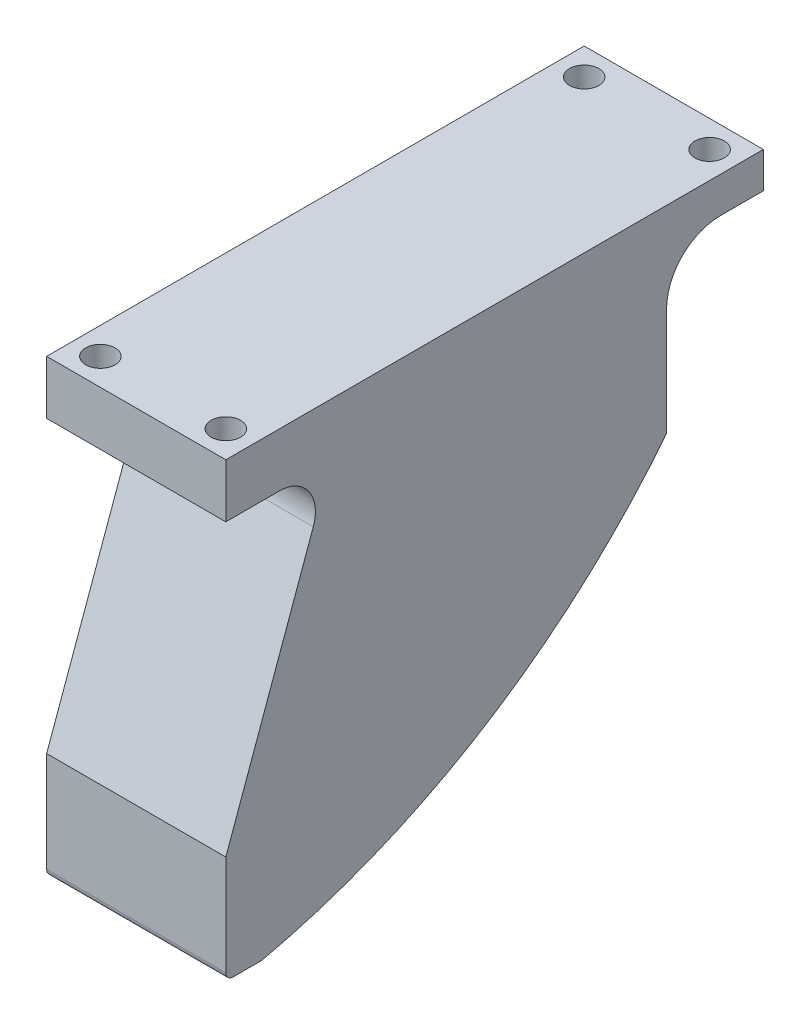
ISO-10303-21;
HEADER;
FILE_DESCRIPTION(('STEP AP214'),'2;1');
FILE_NAME('part.step','',(''),(''),'','','');
FILE_SCHEMA(('AUTOMOTIVE_DESIGN { 1 0 10303 214 1 1 1 1 }'));
ENDSEC;
DATA;
#1=APPLICATION_CONTEXT('core data for automotive mechanical design processes');
#2=APPLICATION_PROTOCOL_DEFINITION('international standard','automotive_design',2000,#1);
#3=PRODUCT_CONTEXT('',#1,'mechanical');
#4=PRODUCT('Part','Part','',(#3));
#5=PRODUCT_RELATED_PRODUCT_CATEGORY('part','',(#4));
#6=PRODUCT_DEFINITION_FORMATION('','',#4);
#7=PRODUCT_DEFINITION_CONTEXT('part definition',#1,'design');
#8=PRODUCT_DEFINITION('design','',#6,#7);
#9=PRODUCT_DEFINITION_SHAPE('','',#8);
#10=(LENGTH_UNIT() NAMED_UNIT(*) SI_UNIT(.MILLI.,.METRE.));
#11=(NAMED_UNIT(*) PLANE_ANGLE_UNIT() SI_UNIT($,.RADIAN.));
#12=(NAMED_UNIT(*) SI_UNIT($,.STERADIAN.) SOLID_ANGLE_UNIT());
#13=UNCERTAINTY_MEASURE_WITH_UNIT(LENGTH_MEASURE(1.E-05),#10,'distance_accuracy_value','');
#14=(GEOMETRIC_REPRESENTATION_CONTEXT(3) GLOBAL_UNCERTAINTY_ASSIGNED_CONTEXT((#13)) GLOBAL_UNIT_ASSIGNED_CONTEXT((#10,
#11,#12)) REPRESENTATION_CONTEXT('',''));
#15=CARTESIAN_POINT('',(0.,0.,0.));
#16=DIRECTION('',(0.,0.,1.));
#17=DIRECTION('',(1.,0.,0.));
#18=AXIS2_PLACEMENT_3D('',#15,#16,#17);
#19=CARTESIAN_POINT('',(0.,-46.750329049547,-58.1304748212491));
#20=DIRECTION('',(1.,0.,0.));
#21=DIRECTION('',(0.,1.,0.));
#22=AXIS2_PLACEMENT_3D('',#19,#20,#21);
#23=PLANE('',#22);
#24=CARTESIAN_POINT('',(0.,-124.,-2.));
#25=DIRECTION('',(1.,0.,0.));
#26=DIRECTION('',(0.,-0.707106781186546,0.707106781186549));
#27=AXIS2_PLACEMENT_3D('',#24,#25,#26);
#28=CIRCLE('',#27,2.);
#29=CARTESIAN_POINT('',(0.,-124.,0.));
#30=VERTEX_POINT('',#29);
#31=CARTESIAN_POINT('',(0.,-126.,-2.));
#32=VERTEX_POINT('',#31);
#33=EDGE_CURVE('E217',#30,#32,#28,.T.);
#34=ORIENTED_EDGE('',*,*,#33,.F.);
#35=DIRECTION('',(0.,1.,0.));
#36=VECTOR('',#35,1.);
#37=CARTESIAN_POINT('',(0.,-126.,0.));
#38=LINE('',#37,#36);
#39=CARTESIAN_POINT('',(0.,-96.,0.));
#40=VERTEX_POINT('',#39);
#41=EDGE_CURVE('E212',#30,#40,#38,.T.);
#42=ORIENTED_EDGE('',*,*,#41,.T.);
#43=DIRECTION('',(0.,0.94058436813575,-0.339560077775158));
#44=VECTOR('',#43,1.);
#45=CARTESIAN_POINT('',(0.,-31.1292362331338,-23.4189747738099));
#46=LINE('',#45,#44);
#47=CARTESIAN_POINT('',(0.,-28.3956007777516,-24.4058436813575));
#48=VERTEX_POINT('',#47);
#49=EDGE_CURVE('E333',#40,#48,#46,.T.);
#50=ORIENTED_EDGE('',*,*,#49,.T.);
#51=CARTESIAN_POINT('',(0.,-25.,-15.));
#52=DIRECTION('',(1.,0.,0.));
#53=DIRECTION('',(0.,-0.339560077775158,-0.94058436813575));
#54=AXIS2_PLACEMENT_3D('',#51,#52,#53);
#55=CIRCLE('',#54,10.);
#56=CARTESIAN_POINT('',(0.,-15.,-15.));
#57=VERTEX_POINT('',#56);
#58=EDGE_CURVE('E307',#48,#57,#55,.T.);
#59=ORIENTED_EDGE('',*,*,#58,.T.);
#60=DIRECTION('',(0.,0.,1.));
#61=VECTOR('',#60,1.);
#62=CARTESIAN_POINT('',(0.,-15.,-29.0652374106246));
#63=LINE('',#62,#61);
#64=CARTESIAN_POINT('',(0.,-15.,0.));
#65=VERTEX_POINT('',#64);
#66=EDGE_CURVE('E320',#57,#65,#63,.T.);
#67=ORIENTED_EDGE('',*,*,#66,.T.);
#68=DIRECTION('',(0.,1.,0.));
#69=VECTOR('',#68,1.);
#70=CARTESIAN_POINT('',(0.,-126.,0.));
#71=LINE('',#70,#69);
#72=CARTESIAN_POINT('',(0.,0.,0.));
#73=VERTEX_POINT('',#72);
#74=EDGE_CURVE('E233',#65,#73,#71,.T.);
#75=ORIENTED_EDGE('',*,*,#74,.T.);
#76=DIRECTION('',(0.,0.,-1.));
#77=VECTOR('',#76,1.);
#78=CARTESIAN_POINT('',(0.,0.,0.));
#79=LINE('',#78,#77);
#80=CARTESIAN_POINT('',(0.,0.,-150.));
#81=VERTEX_POINT('',#80);
#82=EDGE_CURVE('E11',#73,#81,#79,.T.);
#83=ORIENTED_EDGE('',*,*,#82,.T.);
#84=DIRECTION('',(0.,-1.,0.));
#85=VECTOR('',#84,1.);
#86=CARTESIAN_POINT('',(0.,0.,-150.));
#87=LINE('',#86,#85);
#88=CARTESIAN_POINT('',(0.,-10.,-150.));
#89=VERTEX_POINT('',#88);
#90=EDGE_CURVE('E237',#81,#89,#87,.T.);
#91=ORIENTED_EDGE('',*,*,#90,.T.);
#92=DIRECTION('',(0.,0.,1.));
#93=VECTOR('',#92,1.);
#94=CARTESIAN_POINT('',(0.,-10.,-98.0652374106246));
#95=LINE('',#94,#93);
#96=CARTESIAN_POINT('',(0.,-10.,-138.));
#97=VERTEX_POINT('',#96);
#98=EDGE_CURVE('E338',#89,#97,#95,.T.);
#99=ORIENTED_EDGE('',*,*,#98,.T.);
#100=CARTESIAN_POINT('',(0.,-25.,-138.));
#101=DIRECTION('',(1.,0.,0.));
#102=DIRECTION('',(0.,1.,0.));
#103=AXIS2_PLACEMENT_3D('',#100,#101,#102);
#104=CIRCLE('',#103,15.);
#105=CARTESIAN_POINT('',(0.,-25.,-123.));
#106=VERTEX_POINT('',#105);
#107=EDGE_CURVE('E344',#97,#106,#104,.T.);
#108=ORIENTED_EDGE('',*,*,#107,.T.);
#109=DIRECTION('',(0.,-1.,0.));
#110=VECTOR('',#109,1.);
#111=CARTESIAN_POINT('',(0.,-50.9512075724548,-123.));
#112=LINE('',#111,#110);
#113=CARTESIAN_POINT('',(0.,-55.1520860953626,-123.));
#114=VERTEX_POINT('',#113);
#115=EDGE_CURVE('E266',#106,#114,#112,.T.);
#116=ORIENTED_EDGE('',*,*,#115,.T.);
#117=CARTESIAN_POINT('',(0.,69.1762667897678,33.6603353400933));
#118=DIRECTION('',(-1.,0.,0.));
#119=DIRECTION('',(0.,0.975881333948839,0.218301676700467));
#120=AXIS2_PLACEMENT_3D('',#117,#118,#119);
#121=CIRCLE('',#120,200.);
#122=CARTESIAN_POINT('',(0.,-126.,-10.));
#123=VERTEX_POINT('',#122);
#124=EDGE_CURVE('E232',#114,#123,#121,.T.);
#125=ORIENTED_EDGE('',*,*,#124,.T.);
#126=DIRECTION('',(0.,0.,1.));
#127=VECTOR('',#126,1.);
#128=CARTESIAN_POINT('',(0.,-126.,-10.));
#129=LINE('',#128,#127);
#130=EDGE_CURVE('E28',#123,#32,#129,.T.);
#131=ORIENTED_EDGE('',*,*,#130,.T.);
#132=EDGE_LOOP('',(#34,#42,#50,#59,#67,#75,#83,#91,#99,#108,#116,#125,#131));
#133=FACE_BOUND('',#132,.T.);
#134=ADVANCED_FACE('F17',(#133),#23,.F.);
#135=CARTESIAN_POINT('',(0.,0.,-150.));
#136=DIRECTION('',(0.,1.,0.));
#137=DIRECTION('',(0.,0.,-1.));
#138=AXIS2_PLACEMENT_3D('',#135,#136,#137);
#139=PLANE('',#138);
#140=CARTESIAN_POINT('',(42.5,0.,-7.5));
#141=DIRECTION('',(0.,-1.,0.));
#142=DIRECTION('',(1.,0.,0.));
#143=AXIS2_PLACEMENT_3D('',#140,#141,#142);
#144=CIRCLE('',#143,4.1);
#145=CARTESIAN_POINT('',(38.4,0.,-7.5));
#146=VERTEX_POINT('',#145);
#147=EDGE_CURVE('E239',#146,#146,#144,.T.);
#148=ORIENTED_EDGE('',*,*,#147,.T.);
#149=EDGE_LOOP('',(#148));
#150=FACE_BOUND('',#149,.T.);
#151=CARTESIAN_POINT('',(7.5,0.,-142.5));
#152=DIRECTION('',(0.,-1.,0.));
#153=DIRECTION('',(1.,0.,0.));
#154=AXIS2_PLACEMENT_3D('',#151,#152,#153);
#155=CIRCLE('',#154,4.1);
#156=CARTESIAN_POINT('',(3.4,0.,-142.5));
#157=VERTEX_POINT('',#156);
#158=EDGE_CURVE('E278',#157,#157,#155,.T.);
#159=ORIENTED_EDGE('',*,*,#158,.T.);
#160=EDGE_LOOP('',(#159));
#161=FACE_BOUND('',#160,.T.);
#162=CARTESIAN_POINT('',(7.5,0.,-7.5));
#163=DIRECTION('',(0.,-1.,0.));
#164=DIRECTION('',(1.,0.,0.));
#165=AXIS2_PLACEMENT_3D('',#162,#163,#164);
#166=CIRCLE('',#165,4.1);
#167=CARTESIAN_POINT('',(3.4,0.,-7.5));
#168=VERTEX_POINT('',#167);
#169=EDGE_CURVE('E267',#168,#168,#166,.T.);
#170=ORIENTED_EDGE('',*,*,#169,.T.);
#171=EDGE_LOOP('',(#170));
#172=FACE_BOUND('',#171,.T.);
#173=CARTESIAN_POINT('',(42.5,0.,-142.5));
#174=DIRECTION('',(0.,-1.,0.));
#175=DIRECTION('',(1.,0.,0.));
#176=AXIS2_PLACEMENT_3D('',#173,#174,#175);
#177=CIRCLE('',#176,4.1);
#178=CARTESIAN_POINT('',(38.4,0.,-142.5));
#179=VERTEX_POINT('',#178);
#180=EDGE_CURVE('E245',#179,#179,#177,.T.);
#181=ORIENTED_EDGE('',*,*,#180,.T.);
#182=EDGE_LOOP('',(#181));
#183=FACE_BOUND('',#182,.T.);
#184=ORIENTED_EDGE('',*,*,#82,.F.);
#185=DIRECTION('',(1.,0.,0.));
#186=VECTOR('',#185,1.);
#187=CARTESIAN_POINT('',(0.,0.,0.));
#188=LINE('',#187,#186);
#189=CARTESIAN_POINT('',(50.,0.,0.));
#190=VERTEX_POINT('',#189);
#191=EDGE_CURVE('E238',#73,#190,#188,.T.);
#192=ORIENTED_EDGE('',*,*,#191,.T.);
#193=DIRECTION('',(0.,0.,1.));
#194=VECTOR('',#193,1.);
#195=CARTESIAN_POINT('',(50.,0.,0.));
#196=LINE('',#195,#194);
#197=CARTESIAN_POINT('',(50.,0.,-150.));
#198=VERTEX_POINT('',#197);
#199=EDGE_CURVE('E270',#198,#190,#196,.T.);
#200=ORIENTED_EDGE('',*,*,#199,.F.);
#201=DIRECTION('',(1.,0.,0.));
#202=VECTOR('',#201,1.);
#203=CARTESIAN_POINT('',(0.,0.,-150.));
#204=LINE('',#203,#202);
#205=EDGE_CURVE('E139',#81,#198,#204,.T.);
#206=ORIENTED_EDGE('',*,*,#205,.F.);
#207=EDGE_LOOP('',(#184,#192,#200,#206));
#208=FACE_BOUND('',#207,.T.);
#209=ADVANCED_FACE('F384',(#150,#161,#172,#183,#208),#139,.T.);
#210=CARTESIAN_POINT('',(0.,-126.,0.));
#211=DIRECTION('',(0.,-1.,0.));
#212=DIRECTION('',(0.,0.,-1.));
#213=AXIS2_PLACEMENT_3D('',#210,#211,#212);
#214=PLANE('',#213);
#215=DIRECTION('',(1.,0.,0.));
#216=VECTOR('',#215,1.);
#217=CARTESIAN_POINT('',(0.,-126.,-2.));
#218=LINE('',#217,#216);
#219=CARTESIAN_POINT('',(50.,-126.,-2.));
#220=VERTEX_POINT('',#219);
#221=EDGE_CURVE('E206',#32,#220,#218,.T.);
#222=ORIENTED_EDGE('',*,*,#221,.F.);
#223=ORIENTED_EDGE('',*,*,#130,.F.);
#224=DIRECTION('',(1.,0.,0.));
#225=VECTOR('',#224,1.);
#226=CARTESIAN_POINT('',(0.,-126.,-10.));
#227=LINE('',#226,#225);
#228=CARTESIAN_POINT('',(50.,-126.,-10.));
#229=VERTEX_POINT('',#228);
#230=EDGE_CURVE('E229',#123,#229,#227,.T.);
#231=ORIENTED_EDGE('',*,*,#230,.T.);
#232=DIRECTION('',(0.,0.,-1.));
#233=VECTOR('',#232,1.);
#234=CARTESIAN_POINT('',(50.,-126.,-10.));
#235=LINE('',#234,#233);
#236=EDGE_CURVE('E250',#220,#229,#235,.T.);
#237=ORIENTED_EDGE('',*,*,#236,.F.);
#238=EDGE_LOOP('',(#222,#223,#231,#237));
#239=FACE_BOUND('',#238,.T.);
#240=ADVANCED_FACE('F702',(#239),#214,.T.);
#241=CARTESIAN_POINT('',(0.,69.1762667897678,33.6603353400933));
#242=DIRECTION('',(1.,0.,0.));
#243=DIRECTION('',(0.,0.975881333948839,0.218301676700467));
#244=AXIS2_PLACEMENT_3D('',#241,#242,#243);
#245=CYLINDRICAL_SURFACE('',#244,200.);
#246=DIRECTION('',(1.,0.,0.));
#247=VECTOR('',#246,1.);
#248=CARTESIAN_POINT('',(0.,-55.1520860953626,-123.));
#249=LINE('',#248,#247);
#250=CARTESIAN_POINT('',(50.,-55.1520860953626,-123.));
#251=VERTEX_POINT('',#250);
#252=EDGE_CURVE('E265',#114,#251,#249,.T.);
#253=ORIENTED_EDGE('',*,*,#252,.T.);
#254=CARTESIAN_POINT('',(50.,69.1762667897678,33.6603353400933));
#255=DIRECTION('',(1.,0.,0.));
#256=DIRECTION('',(0.,0.975881333948839,0.218301676700467));
#257=AXIS2_PLACEMENT_3D('',#254,#255,#256);
#258=CIRCLE('',#257,200.);
#259=EDGE_CURVE('E253',#229,#251,#258,.T.);
#260=ORIENTED_EDGE('',*,*,#259,.F.);
#261=ORIENTED_EDGE('',*,*,#230,.F.);
#262=ORIENTED_EDGE('',*,*,#124,.F.);
#263=EDGE_LOOP('',(#253,#260,#261,#262));
#264=FACE_BOUND('',#263,.T.);
#265=ADVANCED_FACE('F694',(#264),#245,.T.);
#266=CARTESIAN_POINT('',(0.,-10.,-150.));
#267=DIRECTION('',(0.,0.,-1.));
#268=DIRECTION('',(0.,-1.,0.));
#269=AXIS2_PLACEMENT_3D('',#266,#267,#268);
#270=PLANE('',#269);
#271=ORIENTED_EDGE('',*,*,#90,.F.);
#272=ORIENTED_EDGE('',*,*,#205,.T.);
#273=DIRECTION('',(0.,1.,0.));
#274=VECTOR('',#273,1.);
#275=CARTESIAN_POINT('',(50.,0.,-150.));
#276=LINE('',#275,#274);
#277=CARTESIAN_POINT('',(50.,-10.,-150.));
#278=VERTEX_POINT('',#277);
#279=EDGE_CURVE('E275',#278,#198,#276,.T.);
#280=ORIENTED_EDGE('',*,*,#279,.F.);
#281=DIRECTION('',(1.,0.,0.));
#282=VECTOR('',#281,1.);
#283=CARTESIAN_POINT('',(0.,-10.,-150.));
#284=LINE('',#283,#282);
#285=EDGE_CURVE('E127',#89,#278,#284,.T.);
#286=ORIENTED_EDGE('',*,*,#285,.F.);
#287=EDGE_LOOP('',(#271,#272,#280,#286));
#288=FACE_BOUND('',#287,.T.);
#289=ADVANCED_FACE('F19',(#288),#270,.T.);
#290=CARTESIAN_POINT('',(0.,0.,0.));
#291=DIRECTION('',(0.,0.,1.));
#292=DIRECTION('',(0.,-1.,0.));
#293=AXIS2_PLACEMENT_3D('',#290,#291,#292);
#294=PLANE('',#293);
#295=DIRECTION('',(1.,0.,0.));
#296=VECTOR('',#295,1.);
#297=CARTESIAN_POINT('',(25.,-15.,0.));
#298=LINE('',#297,#296);
#299=CARTESIAN_POINT('',(50.,-15.,0.));
#300=VERTEX_POINT('',#299);
#301=EDGE_CURVE('E330',#65,#300,#298,.T.);
#302=ORIENTED_EDGE('',*,*,#301,.T.);
#303=DIRECTION('',(0.,-1.,0.));
#304=VECTOR('',#303,1.);
#305=CARTESIAN_POINT('',(50.,-126.,0.));
#306=LINE('',#305,#304);
#307=EDGE_CURVE('E274',#190,#300,#306,.T.);
#308=ORIENTED_EDGE('',*,*,#307,.F.);
#309=ORIENTED_EDGE('',*,*,#191,.F.);
#310=ORIENTED_EDGE('',*,*,#74,.F.);
#311=EDGE_LOOP('',(#302,#308,#309,#310));
#312=FACE_BOUND('',#311,.T.);
#313=ADVANCED_FACE('F386',(#312),#294,.T.);
#314=CARTESIAN_POINT('',(50.,-28.3956007777516,-24.4058436813575));
#315=DIRECTION('',(0.,-0.339560077775158,-0.94058436813575));
#316=DIRECTION('',(0.,-0.94058436813575,0.339560077775158));
#317=AXIS2_PLACEMENT_3D('',#314,#315,#316);
#318=PLANE('',#317);
#319=ORIENTED_EDGE('',*,*,#49,.F.);
#320=DIRECTION('',(-1.,0.,0.));
#321=VECTOR('',#320,1.);
#322=CARTESIAN_POINT('',(25.,-96.,0.));
#323=LINE('',#322,#321);
#324=CARTESIAN_POINT('',(50.,-96.,0.));
#325=VERTEX_POINT('',#324);
#326=EDGE_CURVE('E205',#325,#40,#323,.T.);
#327=ORIENTED_EDGE('',*,*,#326,.F.);
#328=DIRECTION('',(0.,-0.94058436813575,0.339560077775158));
#329=VECTOR('',#328,1.);
#330=CARTESIAN_POINT('',(50.,-31.1292362331338,-23.4189747738099));
#331=LINE('',#330,#329);
#332=CARTESIAN_POINT('',(50.,-28.3956007777516,-24.4058436813575));
#333=VERTEX_POINT('',#332);
#334=EDGE_CURVE('E200',#333,#325,#331,.T.);
#335=ORIENTED_EDGE('',*,*,#334,.F.);
#336=DIRECTION('',(-1.,0.,0.));
#337=VECTOR('',#336,1.);
#338=CARTESIAN_POINT('',(50.,-28.3956007777516,-24.4058436813575));
#339=LINE('',#338,#337);
#340=EDGE_CURVE('E302',#333,#48,#339,.T.);
#341=ORIENTED_EDGE('',*,*,#340,.T.);
#342=EDGE_LOOP('',(#319,#327,#335,#341));
#343=FACE_BOUND('',#342,.T.);
#344=ADVANCED_FACE('F667',(#343),#318,.F.);
#345=CARTESIAN_POINT('',(50.,-15.,0.));
#346=DIRECTION('',(0.,1.,0.));
#347=DIRECTION('',(1.,0.,0.));
#348=AXIS2_PLACEMENT_3D('',#345,#346,#347);
#349=PLANE('',#348);
#350=CARTESIAN_POINT('',(42.5,-15.,-7.5));
#351=DIRECTION('',(0.,1.,0.));
#352=DIRECTION('',(1.,0.,0.));
#353=AXIS2_PLACEMENT_3D('',#350,#351,#352);
#354=CIRCLE('',#353,4.1);
#355=CARTESIAN_POINT('',(38.4,-15.,-7.5));
#356=VERTEX_POINT('',#355);
#357=EDGE_CURVE('E315',#356,#356,#354,.T.);
#358=ORIENTED_EDGE('',*,*,#357,.T.);
#359=EDGE_LOOP('',(#358));
#360=FACE_BOUND('',#359,.T.);
#361=CARTESIAN_POINT('',(7.5,-15.,-7.5));
#362=DIRECTION('',(0.,1.,0.));
#363=DIRECTION('',(1.,0.,0.));
#364=AXIS2_PLACEMENT_3D('',#361,#362,#363);
#365=CIRCLE('',#364,4.1);
#366=CARTESIAN_POINT('',(3.4,-15.,-7.5));
#367=VERTEX_POINT('',#366);
#368=EDGE_CURVE('E283',#367,#367,#365,.T.);
#369=ORIENTED_EDGE('',*,*,#368,.T.);
#370=EDGE_LOOP('',(#369));
#371=FACE_BOUND('',#370,.T.);
#372=ORIENTED_EDGE('',*,*,#66,.F.);
#373=DIRECTION('',(-1.,0.,0.));
#374=VECTOR('',#373,1.);
#375=CARTESIAN_POINT('',(50.,-15.,-15.));
#376=LINE('',#375,#374);
#377=CARTESIAN_POINT('',(50.,-15.,-15.));
#378=VERTEX_POINT('',#377);
#379=EDGE_CURVE('E306',#378,#57,#376,.T.);
#380=ORIENTED_EDGE('',*,*,#379,.F.);
#381=DIRECTION('',(0.,0.,-1.));
#382=VECTOR('',#381,1.);
#383=CARTESIAN_POINT('',(50.,-15.,-29.0652374106246));
#384=LINE('',#383,#382);
#385=EDGE_CURVE('E301',#300,#378,#384,.T.);
#386=ORIENTED_EDGE('',*,*,#385,.F.);
#387=ORIENTED_EDGE('',*,*,#301,.F.);
#388=EDGE_LOOP('',(#372,#380,#386,#387));
#389=FACE_BOUND('',#388,.T.);
#390=ADVANCED_FACE('F393',(#360,#371,#389),#349,.F.);
#391=CARTESIAN_POINT('',(50.,-25.,-15.));
#392=DIRECTION('',(-1.,0.,0.));
#393=DIRECTION('',(0.,-0.339560077775158,-0.94058436813575));
#394=AXIS2_PLACEMENT_3D('',#391,#392,#393);
#395=CYLINDRICAL_SURFACE('',#394,10.);
#396=ORIENTED_EDGE('',*,*,#58,.F.);
#397=ORIENTED_EDGE('',*,*,#340,.F.);
#398=CARTESIAN_POINT('',(50.,-25.,-15.));
#399=DIRECTION('',(-1.,0.,0.));
#400=DIRECTION('',(0.,-0.339560077775158,-0.94058436813575));
#401=AXIS2_PLACEMENT_3D('',#398,#399,#400);
#402=CIRCLE('',#401,10.);
#403=EDGE_CURVE('E314',#378,#333,#402,.T.);
#404=ORIENTED_EDGE('',*,*,#403,.F.);
#405=ORIENTED_EDGE('',*,*,#379,.T.);
#406=EDGE_LOOP('',(#396,#397,#404,#405));
#407=FACE_BOUND('',#406,.T.);
#408=ADVANCED_FACE('F649',(#407),#395,.F.);
#409=CARTESIAN_POINT('',(50.,-10.,-138.));
#410=DIRECTION('',(0.,1.,0.));
#411=DIRECTION('',(1.,0.,0.));
#412=AXIS2_PLACEMENT_3D('',#409,#410,#411);
#413=PLANE('',#412);
#414=CARTESIAN_POINT('',(7.5,-10.,-142.5));
#415=DIRECTION('',(0.,1.,0.));
#416=DIRECTION('',(1.,0.,0.));
#417=AXIS2_PLACEMENT_3D('',#414,#415,#416);
#418=CIRCLE('',#417,4.1);
#419=CARTESIAN_POINT('',(3.4,-10.,-142.5));
#420=VERTEX_POINT('',#419);
#421=EDGE_CURVE('E244',#420,#420,#418,.T.);
#422=ORIENTED_EDGE('',*,*,#421,.T.);
#423=EDGE_LOOP('',(#422));
#424=FACE_BOUND('',#423,.T.);
#425=CARTESIAN_POINT('',(42.5,-10.,-142.5));
#426=DIRECTION('',(0.,1.,0.));
#427=DIRECTION('',(1.,0.,0.));
#428=AXIS2_PLACEMENT_3D('',#425,#426,#427);
#429=CIRCLE('',#428,4.1);
#430=CARTESIAN_POINT('',(38.4,-10.,-142.5));
#431=VERTEX_POINT('',#430);
#432=EDGE_CURVE('E183',#431,#431,#429,.T.);
#433=ORIENTED_EDGE('',*,*,#432,.T.);
#434=EDGE_LOOP('',(#433));
#435=FACE_BOUND('',#434,.T.);
#436=ORIENTED_EDGE('',*,*,#98,.F.);
#437=ORIENTED_EDGE('',*,*,#285,.T.);
#438=DIRECTION('',(0.,0.,-1.));
#439=VECTOR('',#438,1.);
#440=CARTESIAN_POINT('',(50.,-10.,-98.0652374106246));
#441=LINE('',#440,#439);
#442=CARTESIAN_POINT('',(50.,-10.,-138.));
#443=VERTEX_POINT('',#442);
#444=EDGE_CURVE('E294',#443,#278,#441,.T.);
#445=ORIENTED_EDGE('',*,*,#444,.F.);
#446=DIRECTION('',(-1.,0.,0.));
#447=VECTOR('',#446,1.);
#448=CARTESIAN_POINT('',(50.,-10.,-138.));
#449=LINE('',#448,#447);
#450=EDGE_CURVE('E341',#443,#97,#449,.T.);
#451=ORIENTED_EDGE('',*,*,#450,.T.);
#452=EDGE_LOOP('',(#436,#437,#445,#451));
#453=FACE_BOUND('',#452,.T.);
#454=ADVANCED_FACE('F389',(#424,#435,#453),#413,.F.);
#455=CARTESIAN_POINT('',(50.,-25.,-138.));
#456=DIRECTION('',(-1.,0.,0.));
#457=DIRECTION('',(0.,1.,0.));
#458=AXIS2_PLACEMENT_3D('',#455,#456,#457);
#459=CYLINDRICAL_SURFACE('',#458,15.);
#460=ORIENTED_EDGE('',*,*,#107,.F.);
#461=ORIENTED_EDGE('',*,*,#450,.F.);
#462=CARTESIAN_POINT('',(50.,-25.,-138.));
#463=DIRECTION('',(-1.,0.,0.));
#464=DIRECTION('',(0.,1.,0.));
#465=AXIS2_PLACEMENT_3D('',#462,#463,#464);
#466=CIRCLE('',#465,15.);
#467=CARTESIAN_POINT('',(50.,-25.,-123.));
#468=VERTEX_POINT('',#467);
#469=EDGE_CURVE('E348',#468,#443,#466,.T.);
#470=ORIENTED_EDGE('',*,*,#469,.F.);
#471=DIRECTION('',(-1.,0.,0.));
#472=VECTOR('',#471,1.);
#473=CARTESIAN_POINT('',(50.,-25.,-123.));
#474=LINE('',#473,#472);
#475=EDGE_CURVE('E261',#468,#106,#474,.T.);
#476=ORIENTED_EDGE('',*,*,#475,.T.);
#477=EDGE_LOOP('',(#460,#461,#470,#476));
#478=FACE_BOUND('',#477,.T.);
#479=ADVANCED_FACE('F629',(#478),#459,.F.);
#480=CARTESIAN_POINT('',(50.,-55.1520860953626,-123.));
#481=DIRECTION('',(0.,0.,1.));
#482=DIRECTION('',(1.,0.,0.));
#483=AXIS2_PLACEMENT_3D('',#480,#481,#482);
#484=PLANE('',#483);
#485=ORIENTED_EDGE('',*,*,#115,.F.);
#486=ORIENTED_EDGE('',*,*,#475,.F.);
#487=DIRECTION('',(0.,1.,0.));
#488=VECTOR('',#487,1.);
#489=CARTESIAN_POINT('',(50.,-50.9512075724548,-123.));
#490=LINE('',#489,#488);
#491=EDGE_CURVE('E21',#251,#468,#490,.T.);
#492=ORIENTED_EDGE('',*,*,#491,.F.);
#493=ORIENTED_EDGE('',*,*,#252,.F.);
#494=EDGE_LOOP('',(#485,#486,#492,#493));
#495=FACE_BOUND('',#494,.T.);
#496=ADVANCED_FACE('F618',(#495),#484,.F.);
#497=CARTESIAN_POINT('',(42.5,-7.5,-7.5));
#498=DIRECTION('',(0.,1.,0.));
#499=DIRECTION('',(1.,0.,0.));
#500=AXIS2_PLACEMENT_3D('',#497,#498,#499);
#501=CYLINDRICAL_SURFACE('',#500,4.1);
#502=ORIENTED_EDGE('',*,*,#147,.F.);
#503=DIRECTION('',(0.,-1.,0.));
#504=VECTOR('',#503,1.);
#505=CARTESIAN_POINT('',(38.4,-7.5,-7.5));
#506=LINE('',#505,#504);
#507=EDGE_CURVE('E243',#146,#356,#506,.T.);
#508=ORIENTED_EDGE('',*,*,#507,.T.);
#509=ORIENTED_EDGE('',*,*,#357,.F.);
#510=ORIENTED_EDGE('',*,*,#507,.F.);
#511=EDGE_LOOP('',(#502,#508,#509,#510));
#512=FACE_BOUND('',#511,.T.);
#513=ADVANCED_FACE('F607',(#512),#501,.F.);
#514=CARTESIAN_POINT('',(7.5,-7.5,-142.5));
#515=DIRECTION('',(0.,1.,0.));
#516=DIRECTION('',(1.,0.,0.));
#517=AXIS2_PLACEMENT_3D('',#514,#515,#516);
#518=CYLINDRICAL_SURFACE('',#517,4.1);
#519=ORIENTED_EDGE('',*,*,#158,.F.);
#520=DIRECTION('',(0.,-1.,0.));
#521=VECTOR('',#520,1.);
#522=CARTESIAN_POINT('',(3.4,-7.5,-142.5));
#523=LINE('',#522,#521);
#524=EDGE_CURVE('E282',#157,#420,#523,.T.);
#525=ORIENTED_EDGE('',*,*,#524,.T.);
#526=ORIENTED_EDGE('',*,*,#421,.F.);
#527=ORIENTED_EDGE('',*,*,#524,.F.);
#528=EDGE_LOOP('',(#519,#525,#526,#527));
#529=FACE_BOUND('',#528,.T.);
#530=ADVANCED_FACE('F597',(#529),#518,.F.);
#531=CARTESIAN_POINT('',(7.5,-7.5,-7.5));
#532=DIRECTION('',(0.,1.,0.));
#533=DIRECTION('',(1.,0.,0.));
#534=AXIS2_PLACEMENT_3D('',#531,#532,#533);
#535=CYLINDRICAL_SURFACE('',#534,4.1);
#536=ORIENTED_EDGE('',*,*,#169,.F.);
#537=DIRECTION('',(0.,-1.,0.));
#538=VECTOR('',#537,1.);
#539=CARTESIAN_POINT('',(3.4,-7.5,-7.5));
#540=LINE('',#539,#538);
#541=EDGE_CURVE('E173',#168,#367,#540,.T.);
#542=ORIENTED_EDGE('',*,*,#541,.T.);
#543=ORIENTED_EDGE('',*,*,#368,.F.);
#544=ORIENTED_EDGE('',*,*,#541,.F.);
#545=EDGE_LOOP('',(#536,#542,#543,#544));
#546=FACE_BOUND('',#545,.T.);
#547=ADVANCED_FACE('F584',(#546),#535,.F.);
#548=CARTESIAN_POINT('',(42.5,-7.5,-142.5));
#549=DIRECTION('',(0.,1.,0.));
#550=DIRECTION('',(1.,0.,0.));
#551=AXIS2_PLACEMENT_3D('',#548,#549,#550);
#552=CYLINDRICAL_SURFACE('',#551,4.1);
#553=ORIENTED_EDGE('',*,*,#180,.F.);
#554=DIRECTION('',(0.,-1.,0.));
#555=VECTOR('',#554,1.);
#556=CARTESIAN_POINT('',(38.4,-7.5,-142.5));
#557=LINE('',#556,#555);
#558=EDGE_CURVE('E249',#179,#431,#557,.T.);
#559=ORIENTED_EDGE('',*,*,#558,.T.);
#560=ORIENTED_EDGE('',*,*,#432,.F.);
#561=ORIENTED_EDGE('',*,*,#558,.F.);
#562=EDGE_LOOP('',(#553,#559,#560,#561));
#563=FACE_BOUND('',#562,.T.);
#564=ADVANCED_FACE('F572',(#563),#552,.F.);
#565=CARTESIAN_POINT('',(50.,-46.750329049547,-58.1304748212491));
#566=DIRECTION('',(1.,0.,0.));
#567=DIRECTION('',(0.,1.,0.));
#568=AXIS2_PLACEMENT_3D('',#565,#566,#567);
#569=PLANE('',#568);
#570=CARTESIAN_POINT('',(50.,-124.,-2.));
#571=DIRECTION('',(-1.,0.,0.));
#572=DIRECTION('',(0.,-0.707106781186546,0.707106781186549));
#573=AXIS2_PLACEMENT_3D('',#570,#571,#572);
#574=CIRCLE('',#573,2.);
#575=CARTESIAN_POINT('',(50.,-124.,0.));
#576=VERTEX_POINT('',#575);
#577=EDGE_CURVE('E197',#220,#576,#574,.T.);
#578=ORIENTED_EDGE('',*,*,#577,.F.);
#579=ORIENTED_EDGE('',*,*,#236,.T.);
#580=ORIENTED_EDGE('',*,*,#259,.T.);
#581=ORIENTED_EDGE('',*,*,#491,.T.);
#582=ORIENTED_EDGE('',*,*,#469,.T.);
#583=ORIENTED_EDGE('',*,*,#444,.T.);
#584=ORIENTED_EDGE('',*,*,#279,.T.);
#585=ORIENTED_EDGE('',*,*,#199,.T.);
#586=ORIENTED_EDGE('',*,*,#307,.T.);
#587=ORIENTED_EDGE('',*,*,#385,.T.);
#588=ORIENTED_EDGE('',*,*,#403,.T.);
#589=ORIENTED_EDGE('',*,*,#334,.T.);
#590=DIRECTION('',(0.,-1.,0.));
#591=VECTOR('',#590,1.);
#592=CARTESIAN_POINT('',(50.,-126.,0.));
#593=LINE('',#592,#591);
#594=EDGE_CURVE('E192',#325,#576,#593,.T.);
#595=ORIENTED_EDGE('',*,*,#594,.T.);
#596=EDGE_LOOP('',(#578,#579,#580,#581,#582,#583,#584,#585,#586,#587,#588,#589,#595));
#597=FACE_BOUND('',#596,.T.);
#598=ADVANCED_FACE('F194',(#597),#569,.T.);
#599=CARTESIAN_POINT('',(0.,0.,0.));
#600=DIRECTION('',(0.,0.,1.));
#601=DIRECTION('',(0.,-1.,0.));
#602=AXIS2_PLACEMENT_3D('',#599,#600,#601);
#603=PLANE('',#602);
#604=DIRECTION('',(-1.,0.,0.));
#605=VECTOR('',#604,1.);
#606=CARTESIAN_POINT('',(0.,-124.,0.));
#607=LINE('',#606,#605);
#608=EDGE_CURVE('E209',#576,#30,#607,.T.);
#609=ORIENTED_EDGE('',*,*,#608,.F.);
#610=ORIENTED_EDGE('',*,*,#594,.F.);
#611=ORIENTED_EDGE('',*,*,#326,.T.);
#612=ORIENTED_EDGE('',*,*,#41,.F.);
#613=EDGE_LOOP('',(#609,#610,#611,#612));
#614=FACE_BOUND('',#613,.T.);
#615=ADVANCED_FACE('F210',(#614),#603,.T.);
#616=CARTESIAN_POINT('',(0.,-124.,-2.));
#617=DIRECTION('',(1.,0.,0.));
#618=DIRECTION('',(0.,-0.707106781186546,0.707106781186549));
#619=AXIS2_PLACEMENT_3D('',#616,#617,#618);
#620=CYLINDRICAL_SURFACE('',#619,2.);
#621=ORIENTED_EDGE('',*,*,#577,.T.);
#622=ORIENTED_EDGE('',*,*,#608,.T.);
#623=ORIENTED_EDGE('',*,*,#33,.T.);
#624=ORIENTED_EDGE('',*,*,#221,.T.);
#625=EDGE_LOOP('',(#621,#622,#623,#624));
#626=FACE_BOUND('',#625,.T.);
#627=ADVANCED_FACE('F220',(#626),#620,.T.);
#628=CLOSED_SHELL('',(#134,#209,#240,#265,#289,#313,#344,#390,#408,#454,#479,#496,#513,#530,
#547,#564,#598,#615,#627));
#629=MANIFOLD_SOLID_BREP('B1',#628);
#630=ADVANCED_BREP_SHAPE_REPRESENTATION('',(#18,#629),#14);
#631=SHAPE_DEFINITION_REPRESENTATION(#9,#630);
ENDSEC;
END-ISO-10303-21;
